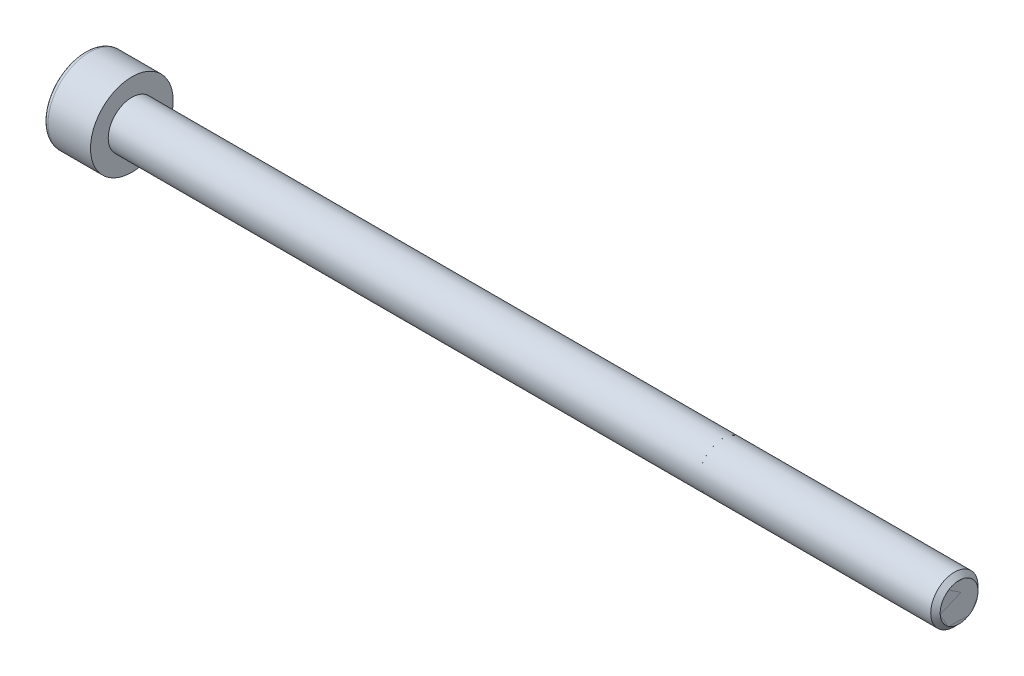
ISO-10303-21;
HEADER;
FILE_DESCRIPTION(('STEP AP214'),'2;1');
FILE_NAME('part.step','',(''),(''),'','','');
FILE_SCHEMA(('AUTOMOTIVE_DESIGN { 1 0 10303 214 1 1 1 1 }'));
ENDSEC;
DATA;
#1=APPLICATION_CONTEXT('core data for automotive mechanical design processes');
#2=APPLICATION_PROTOCOL_DEFINITION('international standard','automotive_design',2000,#1);
#3=PRODUCT_CONTEXT('',#1,'mechanical');
#4=PRODUCT('Part','Part','',(#3));
#5=PRODUCT_RELATED_PRODUCT_CATEGORY('part','',(#4));
#6=PRODUCT_DEFINITION_FORMATION('','',#4);
#7=PRODUCT_DEFINITION_CONTEXT('part definition',#1,'design');
#8=PRODUCT_DEFINITION('design','',#6,#7);
#9=PRODUCT_DEFINITION_SHAPE('','',#8);
#10=(LENGTH_UNIT() NAMED_UNIT(*) SI_UNIT(.MILLI.,.METRE.));
#11=(NAMED_UNIT(*) PLANE_ANGLE_UNIT() SI_UNIT($,.RADIAN.));
#12=(NAMED_UNIT(*) SI_UNIT($,.STERADIAN.) SOLID_ANGLE_UNIT());
#13=UNCERTAINTY_MEASURE_WITH_UNIT(LENGTH_MEASURE(1.E-05),#10,'distance_accuracy_value','');
#14=(GEOMETRIC_REPRESENTATION_CONTEXT(3) GLOBAL_UNCERTAINTY_ASSIGNED_CONTEXT((#13)) GLOBAL_UNIT_ASSIGNED_CONTEXT((#10,
#11,#12)) REPRESENTATION_CONTEXT('',''));
#15=CARTESIAN_POINT('',(0.,0.,0.));
#16=DIRECTION('',(0.,0.,1.));
#17=DIRECTION('',(1.,0.,0.));
#18=AXIS2_PLACEMENT_3D('',#15,#16,#17);
#19=CARTESIAN_POINT('',(2.,1.5,-0.8660254037844));
#20=DIRECTION('',(0.,0.500000000000017,-0.866025403784429));
#21=DIRECTION('',(0.,0.866025403784429,0.500000000000017));
#22=AXIS2_PLACEMENT_3D('',#19,#20,#21);
#23=PLANE('',#22);
#24=DIRECTION('',(0.,0.866025403784429,0.500000000000017));
#25=VECTOR('',#24,1.);
#26=CARTESIAN_POINT('',(2.,1.5,-0.8660254037844));
#27=LINE('',#26,#25);
#28=CARTESIAN_POINT('',(2.,1.5,-0.8660254037844));
#29=VERTEX_POINT('',#28);
#30=CARTESIAN_POINT('',(2.,0.,-1.73205080756895));
#31=VERTEX_POINT('',#30);
#32=EDGE_CURVE('P0_E71',#29,#31,#27,.F.);
#33=ORIENTED_EDGE('',*,*,#32,.F.);
#34=DIRECTION('',(1.,0.,0.));
#35=VECTOR('',#34,1.);
#36=CARTESIAN_POINT('',(2.,1.5,-0.8660254037844));
#37=LINE('',#36,#35);
#38=CARTESIAN_POINT('',(0.,1.5,-0.8660254037844));
#39=VERTEX_POINT('',#38);
#40=EDGE_CURVE('P0_E95',#29,#39,#37,.F.);
#41=ORIENTED_EDGE('',*,*,#40,.T.);
#42=DIRECTION('',(0.,0.866025403784429,0.500000000000017));
#43=VECTOR('',#42,1.);
#44=CARTESIAN_POINT('',(0.,1.5,-0.8660254037844));
#45=LINE('',#44,#43);
#46=CARTESIAN_POINT('',(0.,0.,-1.73205080756898));
#47=VERTEX_POINT('',#46);
#48=EDGE_CURVE('P0_E81',#47,#39,#45,.T.);
#49=ORIENTED_EDGE('',*,*,#48,.F.);
#50=DIRECTION('',(1.,0.,0.));
#51=VECTOR('',#50,1.);
#52=CARTESIAN_POINT('',(2.,0.,-1.732050807569));
#53=LINE('',#52,#51);
#54=EDGE_CURVE('P0_E90',#47,#31,#53,.T.);
#55=ORIENTED_EDGE('',*,*,#54,.T.);
#56=EDGE_LOOP('',(#33,#41,#49,#55));
#57=FACE_BOUND('',#56,.T.);
#58=ADVANCED_FACE('P0_F17',(#57),#23,.F.);
#59=CARTESIAN_POINT('',(2.,0.,-1.732050807569));
#60=DIRECTION('',(0.,-0.500000000000017,-0.866025403784429));
#61=DIRECTION('',(0.,0.866025403784429,-0.500000000000017));
#62=AXIS2_PLACEMENT_3D('',#59,#60,#61);
#63=PLANE('',#62);
#64=DIRECTION('',(0.,0.866025403784429,-0.500000000000017));
#65=VECTOR('',#64,1.);
#66=CARTESIAN_POINT('',(2.,0.,-1.732050807569));
#67=LINE('',#66,#65);
#68=CARTESIAN_POINT('',(2.,-1.50000000000003,-0.866025403784446));
#69=VERTEX_POINT('',#68);
#70=EDGE_CURVE('P0_E99',#31,#69,#67,.F.);
#71=ORIENTED_EDGE('',*,*,#70,.F.);
#72=ORIENTED_EDGE('',*,*,#54,.F.);
#73=DIRECTION('',(0.,0.866025403784429,-0.500000000000017));
#74=VECTOR('',#73,1.);
#75=CARTESIAN_POINT('',(0.,0.,-1.732050807569));
#76=LINE('',#75,#74);
#77=CARTESIAN_POINT('',(0.,-1.50000000000001,-0.866025403784423));
#78=VERTEX_POINT('',#77);
#79=EDGE_CURVE('P0_E76',#78,#47,#76,.T.);
#80=ORIENTED_EDGE('',*,*,#79,.F.);
#81=DIRECTION('',(1.,0.,0.));
#82=VECTOR('',#81,1.);
#83=CARTESIAN_POINT('',(2.,-1.5,-0.8660254037844));
#84=LINE('',#83,#82);
#85=EDGE_CURVE('P0_E168',#78,#69,#84,.T.);
#86=ORIENTED_EDGE('',*,*,#85,.T.);
#87=EDGE_LOOP('',(#71,#72,#80,#86));
#88=FACE_BOUND('',#87,.T.);
#89=ADVANCED_FACE('P0_F98',(#88),#63,.F.);
#90=CARTESIAN_POINT('',(2.,1.5,0.8660254037844));
#91=DIRECTION('',(0.,1.,0.));
#92=DIRECTION('',(0.,0.,1.));
#93=AXIS2_PLACEMENT_3D('',#90,#91,#92);
#94=PLANE('',#93);
#95=DIRECTION('',(0.,0.,1.));
#96=VECTOR('',#95,1.);
#97=CARTESIAN_POINT('',(2.,1.5,0.));
#98=LINE('',#97,#96);
#99=CARTESIAN_POINT('',(2.,1.50000000000001,0.866025403784423));
#100=VERTEX_POINT('',#99);
#101=EDGE_CURVE('P0_E166',#100,#29,#98,.F.);
#102=ORIENTED_EDGE('',*,*,#101,.F.);
#103=DIRECTION('',(1.,0.,0.));
#104=VECTOR('',#103,1.);
#105=CARTESIAN_POINT('',(2.,1.50000000000005,0.866025403784492));
#106=LINE('',#105,#104);
#107=CARTESIAN_POINT('',(0.,1.50000000000001,0.866025403784423));
#108=VERTEX_POINT('',#107);
#109=EDGE_CURVE('P0_E155',#100,#108,#106,.F.);
#110=ORIENTED_EDGE('',*,*,#109,.T.);
#111=DIRECTION('',(0.,0.,1.));
#112=VECTOR('',#111,1.);
#113=CARTESIAN_POINT('',(0.,1.5,0.8660254037844));
#114=LINE('',#113,#112);
#115=EDGE_CURVE('P0_E101',#39,#108,#114,.T.);
#116=ORIENTED_EDGE('',*,*,#115,.F.);
#117=ORIENTED_EDGE('',*,*,#40,.F.);
#118=EDGE_LOOP('',(#102,#110,#116,#117));
#119=FACE_BOUND('',#118,.T.);
#120=ADVANCED_FACE('P0_F174',(#119),#94,.F.);
#121=CARTESIAN_POINT('',(2.,-1.5,-0.8660254037844));
#122=DIRECTION('',(0.,-1.,0.));
#123=DIRECTION('',(0.,0.,-1.));
#124=AXIS2_PLACEMENT_3D('',#121,#122,#123);
#125=PLANE('',#124);
#126=DIRECTION('',(0.,0.,1.));
#127=VECTOR('',#126,1.);
#128=CARTESIAN_POINT('',(2.,-1.5,0.));
#129=LINE('',#128,#127);
#130=CARTESIAN_POINT('',(2.,-1.5,0.8660254037844));
#131=VERTEX_POINT('',#130);
#132=EDGE_CURVE('P0_E163',#69,#131,#129,.T.);
#133=ORIENTED_EDGE('',*,*,#132,.F.);
#134=ORIENTED_EDGE('',*,*,#85,.F.);
#135=DIRECTION('',(0.,0.,-1.));
#136=VECTOR('',#135,1.);
#137=CARTESIAN_POINT('',(0.,-1.5,-0.8660254037844));
#138=LINE('',#137,#136);
#139=CARTESIAN_POINT('',(0.,-1.5,0.8660254037844));
#140=VERTEX_POINT('',#139);
#141=EDGE_CURVE('P0_E85',#140,#78,#138,.T.);
#142=ORIENTED_EDGE('',*,*,#141,.F.);
#143=DIRECTION('',(1.,0.,0.));
#144=VECTOR('',#143,1.);
#145=CARTESIAN_POINT('',(2.,-1.5,0.8660254037844));
#146=LINE('',#145,#144);
#147=EDGE_CURVE('P0_E153',#140,#131,#146,.T.);
#148=ORIENTED_EDGE('',*,*,#147,.T.);
#149=EDGE_LOOP('',(#133,#134,#142,#148));
#150=FACE_BOUND('',#149,.T.);
#151=ADVANCED_FACE('P0_F268',(#150),#125,.F.);
#152=CARTESIAN_POINT('',(2.,0.,0.));
#153=DIRECTION('',(-1.,0.,0.));
#154=DIRECTION('',(0.,0.,1.));
#155=AXIS2_PLACEMENT_3D('',#152,#153,#154);
#156=PLANE('',#155);
#157=ORIENTED_EDGE('',*,*,#132,.T.);
#158=DIRECTION('',(0.,-0.866025403784429,-0.500000000000017));
#159=VECTOR('',#158,1.);
#160=CARTESIAN_POINT('',(2.,-1.5,0.8660254037844));
#161=LINE('',#160,#159);
#162=CARTESIAN_POINT('',(2.,0.,1.73205080756898));
#163=VERTEX_POINT('',#162);
#164=EDGE_CURVE('P0_E151',#131,#163,#161,.F.);
#165=ORIENTED_EDGE('',*,*,#164,.T.);
#166=DIRECTION('',(0.,-0.866025403784429,0.500000000000017));
#167=VECTOR('',#166,1.);
#168=CARTESIAN_POINT('',(2.,0.,1.732050807569));
#169=LINE('',#168,#167);
#170=EDGE_CURVE('P0_E158',#163,#100,#169,.F.);
#171=ORIENTED_EDGE('',*,*,#170,.T.);
#172=ORIENTED_EDGE('',*,*,#101,.T.);
#173=ORIENTED_EDGE('',*,*,#32,.T.);
#174=ORIENTED_EDGE('',*,*,#70,.T.);
#175=EDGE_LOOP('',(#157,#165,#171,#172,#173,#174));
#176=FACE_BOUND('',#175,.T.);
#177=ADVANCED_FACE('P0_F259',(#176),#156,.T.);
#178=CARTESIAN_POINT('',(2.,0.,1.732050807569));
#179=DIRECTION('',(0.,0.500000000000017,0.866025403784429));
#180=DIRECTION('',(0.,-0.866025403784429,0.500000000000017));
#181=AXIS2_PLACEMENT_3D('',#178,#179,#180);
#182=PLANE('',#181);
#183=ORIENTED_EDGE('',*,*,#170,.F.);
#184=DIRECTION('',(1.,0.,0.));
#185=VECTOR('',#184,1.);
#186=CARTESIAN_POINT('',(2.,0.,1.73205080756891));
#187=LINE('',#186,#185);
#188=CARTESIAN_POINT('',(0.,0.,1.73205080756898));
#189=VERTEX_POINT('',#188);
#190=EDGE_CURVE('P0_E142',#163,#189,#187,.F.);
#191=ORIENTED_EDGE('',*,*,#190,.T.);
#192=DIRECTION('',(0.,-0.866025403784429,0.500000000000017));
#193=VECTOR('',#192,1.);
#194=CARTESIAN_POINT('',(0.,0.,1.732050807569));
#195=LINE('',#194,#193);
#196=EDGE_CURVE('P0_E161',#108,#189,#195,.T.);
#197=ORIENTED_EDGE('',*,*,#196,.F.);
#198=ORIENTED_EDGE('',*,*,#109,.F.);
#199=EDGE_LOOP('',(#183,#191,#197,#198));
#200=FACE_BOUND('',#199,.T.);
#201=ADVANCED_FACE('P0_F177',(#200),#182,.F.);
#202=CARTESIAN_POINT('',(2.,-1.5,0.8660254037844));
#203=DIRECTION('',(0.,-0.500000000000017,0.866025403784429));
#204=DIRECTION('',(0.,-0.866025403784429,-0.500000000000017));
#205=AXIS2_PLACEMENT_3D('',#202,#203,#204);
#206=PLANE('',#205);
#207=ORIENTED_EDGE('',*,*,#164,.F.);
#208=ORIENTED_EDGE('',*,*,#147,.F.);
#209=DIRECTION('',(0.,-0.866025403784398,-0.50000000000007));
#210=VECTOR('',#209,1.);
#211=CARTESIAN_POINT('',(0.,0.,1.732050807569));
#212=LINE('',#211,#210);
#213=EDGE_CURVE('P0_E150',#189,#140,#212,.T.);
#214=ORIENTED_EDGE('',*,*,#213,.F.);
#215=ORIENTED_EDGE('',*,*,#190,.F.);
#216=EDGE_LOOP('',(#207,#208,#214,#215));
#217=FACE_BOUND('',#216,.T.);
#218=ADVANCED_FACE('P0_F183',(#217),#206,.F.);
#219=CARTESIAN_POINT('',(0.,0.,0.));
#220=DIRECTION('',(-1.,0.,0.));
#221=DIRECTION('',(0.,0.,1.));
#222=AXIS2_PLACEMENT_3D('',#219,#220,#221);
#223=PLANE('',#222);
#224=ORIENTED_EDGE('',*,*,#196,.T.);
#225=ORIENTED_EDGE('',*,*,#213,.T.);
#226=ORIENTED_EDGE('',*,*,#141,.T.);
#227=ORIENTED_EDGE('',*,*,#79,.T.);
#228=ORIENTED_EDGE('',*,*,#48,.T.);
#229=ORIENTED_EDGE('',*,*,#115,.T.);
#230=EDGE_LOOP('',(#224,#225,#226,#227,#228,#229));
#231=FACE_BOUND('',#230,.T.);
#232=CARTESIAN_POINT('',(0.,0.,0.));
#233=DIRECTION('',(1.,0.,0.));
#234=DIRECTION('',(0.,-1.,0.));
#235=AXIS2_PLACEMENT_3D('',#232,#233,#234);
#236=CIRCLE('',#235,3.1);
#237=CARTESIAN_POINT('',(0.,-3.1,0.));
#238=VERTEX_POINT('',#237);
#239=CARTESIAN_POINT('',(0.,3.1,0.));
#240=VERTEX_POINT('',#239);
#241=EDGE_CURVE('P0_E36',#238,#240,#236,.T.);
#242=ORIENTED_EDGE('',*,*,#241,.F.);
#243=CARTESIAN_POINT('',(0.,0.,0.));
#244=DIRECTION('',(1.,0.,0.));
#245=DIRECTION('',(0.,1.,0.));
#246=AXIS2_PLACEMENT_3D('',#243,#244,#245);
#247=CIRCLE('',#246,3.1);
#248=EDGE_CURVE('P0_E117',#240,#238,#247,.T.);
#249=ORIENTED_EDGE('',*,*,#248,.F.);
#250=EDGE_LOOP('',(#242,#249));
#251=FACE_BOUND('',#250,.T.);
#252=ADVANCED_FACE('P0_F79',(#231,#251),#223,.T.);
#253=CARTESIAN_POINT('',(0.4,0.,0.));
#254=DIRECTION('',(-1.,0.,0.));
#255=DIRECTION('',(0.,1.,0.));
#256=AXIS2_PLACEMENT_3D('',#253,#254,#255);
#257=TOROIDAL_SURFACE('',#256,3.1,0.4);
#258=CARTESIAN_POINT('',(0.399999999999998,0.,0.));
#259=DIRECTION('',(-1.,0.,0.));
#260=DIRECTION('',(0.,0.,1.));
#261=AXIS2_PLACEMENT_3D('',#258,#259,#260);
#262=CIRCLE('',#261,3.5);
#263=CARTESIAN_POINT('',(0.399999999999998,0.,3.5));
#264=VERTEX_POINT('',#263);
#265=EDGE_CURVE('P0_E113',#264,#264,#262,.F.);
#266=ORIENTED_EDGE('',*,*,#265,.F.);
#267=EDGE_LOOP('',(#266));
#268=FACE_BOUND('',#267,.T.);
#269=ORIENTED_EDGE('',*,*,#248,.T.);
#270=ORIENTED_EDGE('',*,*,#241,.T.);
#271=EDGE_LOOP('',(#269,#270));
#272=FACE_BOUND('',#271,.T.);
#273=ADVANCED_FACE('P0_F125',(#268,#272),#257,.T.);
#274=CARTESIAN_POINT('',(77.7,0.,0.));
#275=DIRECTION('',(-1.,0.,0.));
#276=DIRECTION('',(0.,0.,1.));
#277=AXIS2_PLACEMENT_3D('',#274,#275,#276);
#278=CYLINDRICAL_SURFACE('',#277,3.5);
#279=CARTESIAN_POINT('',(4.,0.,0.));
#280=DIRECTION('',(-1.,0.,0.));
#281=DIRECTION('',(0.,0.,1.));
#282=AXIS2_PLACEMENT_3D('',#279,#280,#281);
#283=CIRCLE('',#282,3.5);
#284=CARTESIAN_POINT('',(4.,0.,3.5));
#285=VERTEX_POINT('',#284);
#286=EDGE_CURVE('P0_E111',#285,#285,#283,.T.);
#287=ORIENTED_EDGE('',*,*,#286,.T.);
#288=EDGE_LOOP('',(#287));
#289=FACE_BOUND('',#288,.T.);
#290=ORIENTED_EDGE('',*,*,#265,.T.);
#291=EDGE_LOOP('',(#290));
#292=FACE_BOUND('',#291,.T.);
#293=ADVANCED_FACE('P0_F130',(#289,#292),#278,.T.);
#294=CARTESIAN_POINT('',(74.,0.,0.));
#295=DIRECTION('',(-1.,0.,0.));
#296=DIRECTION('',(0.,0.,1.));
#297=AXIS2_PLACEMENT_3D('',#294,#295,#296);
#298=PLANE('',#297);
#299=CARTESIAN_POINT('',(74.0000000000123,0.,0.));
#300=DIRECTION('',(-1.,0.,0.));
#301=DIRECTION('',(0.,0.,1.));
#302=AXIS2_PLACEMENT_3D('',#299,#300,#301);
#303=CIRCLE('',#302,1.59999999999627);
#304=CARTESIAN_POINT('',(74.0000000000123,0.,1.59999999999627));
#305=VERTEX_POINT('',#304);
#306=EDGE_CURVE('P0_E108',#305,#305,#303,.T.);
#307=ORIENTED_EDGE('',*,*,#306,.F.);
#308=EDGE_LOOP('',(#307));
#309=FACE_BOUND('',#308,.T.);
#310=ADVANCED_FACE('P0_F219',(#309),#298,.F.);
#311=CARTESIAN_POINT('',(4.,0.,0.));
#312=DIRECTION('',(-1.,0.,0.));
#313=DIRECTION('',(0.,0.,1.));
#314=AXIS2_PLACEMENT_3D('',#311,#312,#313);
#315=PLANE('',#314);
#316=CARTESIAN_POINT('',(4.,0.,0.));
#317=DIRECTION('',(-1.,0.,0.));
#318=DIRECTION('',(0.,0.,1.));
#319=AXIS2_PLACEMENT_3D('',#316,#317,#318);
#320=CIRCLE('',#319,2.);
#321=CARTESIAN_POINT('',(4.,0.,2.));
#322=VERTEX_POINT('',#321);
#323=EDGE_CURVE('P0_E28',#322,#322,#320,.F.);
#324=ORIENTED_EDGE('',*,*,#323,.F.);
#325=EDGE_LOOP('',(#324));
#326=FACE_BOUND('',#325,.T.);
#327=ORIENTED_EDGE('',*,*,#286,.F.);
#328=EDGE_LOOP('',(#327));
#329=FACE_BOUND('',#328,.T.);
#330=ADVANCED_FACE('P0_F213',(#326,#329),#315,.F.);
#331=CARTESIAN_POINT('',(73.6000000001127,0.,0.));
#332=DIRECTION('',(-1.,0.,0.));
#333=DIRECTION('',(0.,0.,1.));
#334=AXIS2_PLACEMENT_3D('',#331,#332,#333);
#335=CONICAL_SURFACE('',#334,1.99999999989586,0.785398163397448);
#336=ORIENTED_EDGE('',*,*,#306,.T.);
#337=EDGE_LOOP('',(#336));
#338=FACE_BOUND('',#337,.T.);
#339=CARTESIAN_POINT('',(73.6,0.,0.));
#340=DIRECTION('',(-1.,0.,0.));
#341=DIRECTION('',(0.,0.,1.));
#342=AXIS2_PLACEMENT_3D('',#339,#340,#341);
#343=CIRCLE('',#342,2.);
#344=CARTESIAN_POINT('',(73.6,0.,2.));
#345=VERTEX_POINT('',#344);
#346=EDGE_CURVE('P0_E11',#345,#345,#343,.T.);
#347=ORIENTED_EDGE('',*,*,#346,.F.);
#348=EDGE_LOOP('',(#347));
#349=FACE_BOUND('',#348,.T.);
#350=ADVANCED_FACE('P0_F207',(#338,#349),#335,.T.);
#351=CARTESIAN_POINT('',(77.7,0.,0.));
#352=DIRECTION('',(-1.,0.,0.));
#353=DIRECTION('',(0.,0.,1.));
#354=AXIS2_PLACEMENT_3D('',#351,#352,#353);
#355=CYLINDRICAL_SURFACE('',#354,2.);
#356=ORIENTED_EDGE('',*,*,#346,.T.);
#357=EDGE_LOOP('',(#356));
#358=FACE_BOUND('',#357,.T.);
#359=ORIENTED_EDGE('',*,*,#323,.T.);
#360=EDGE_LOOP('',(#359));
#361=FACE_BOUND('',#360,.T.);
#362=ADVANCED_FACE('P0_F205',(#358,#361),#355,.T.);
#363=CLOSED_SHELL('',(#58,#89,#120,#151,#177,#201,#218,#252,#273,#293,#310,#330,#350,#362));
#364=MANIFOLD_SOLID_BREP('P0_B1',#363);
#365=CARTESIAN_POINT('',(54.,0.,0.));
#366=DIRECTION('',(1.,0.,0.));
#367=DIRECTION('',(0.,0.,-1.));
#368=AXIS2_PLACEMENT_3D('',#365,#366,#367);
#369=PLANE('',#368);
#370=CARTESIAN_POINT('',(54.,-2.,0.));
#371=CARTESIAN_POINT('',(54.,-1.99774586766325,-0.402717718090076));
#372=CARTESIAN_POINT('',(54.,-1.84788068745405,-0.764664479633677));
#373=CARTESIAN_POINT('',(54.,-1.69532712507373,-1.13310408507384));
#374=CARTESIAN_POINT('',(54.,-1.41417740186145,-1.41429353376039));
#375=CARTESIAN_POINT('',(54.,-1.13318421417824,-1.69532642479994));
#376=CARTESIAN_POINT('',(54.,-0.765364797462188,-1.8477599065349));
#377=CARTESIAN_POINT('',(54.,-0.398369886191421,-1.99985169278011));
#378=CARTESIAN_POINT('',(54.,0.,-1.99995802016326));
#379=CARTESIAN_POINT('',(54.,0.397297997638056,-2.00006406145273));
#380=CARTESIAN_POINT('',(54.,0.765364797462188,-1.8477599065349));
#381=CARTESIAN_POINT('',(54.,1.13227384248478,-1.69593482461887));
#382=CARTESIAN_POINT('',(54.,1.41417740186145,-1.41429353376039));
#383=CARTESIAN_POINT('',(54.,1.69472319973728,-1.13400874121154));
#384=CARTESIAN_POINT('',(54.,1.84788068745406,-0.764664479633658));
#385=CARTESIAN_POINT('',(54.,1.99774279237885,-0.403267140808738));
#386=CARTESIAN_POINT('',(54.,2.,0.));
#387=B_SPLINE_CURVE_WITH_KNOTS('',2,(#370,#371,#372,#373,#374,#375,#376,#377,#378,#379,#380,
#381,#382,#383,#384,#385,#386),.UNSPECIFIED.,.F.,.F.,(3,2,2,2,2,2,2,2,3),(0.,0.125,0.25,0.375,
0.5,0.625,0.75,0.875,1.),.UNSPECIFIED.);
#388=CARTESIAN_POINT('',(54.,-2.,0.));
#389=VERTEX_POINT('',#388);
#390=CARTESIAN_POINT('',(54.,2.,0.));
#391=VERTEX_POINT('',#390);
#392=EDGE_CURVE('P1_E32',#389,#391,#387,.T.);
#393=ORIENTED_EDGE('',*,*,#392,.F.);
#394=CARTESIAN_POINT('',(54.,2.,0.));
#395=CARTESIAN_POINT('',(54.,1.99774586766324,0.402717718090762));
#396=CARTESIAN_POINT('',(54.,1.84788068745406,0.764664479633658));
#397=CARTESIAN_POINT('',(54.,1.69532712507302,1.13310408507488));
#398=CARTESIAN_POINT('',(54.,1.41417740186145,1.41429353376039));
#399=CARTESIAN_POINT('',(54.,1.13318421417782,1.69532642480003));
#400=CARTESIAN_POINT('',(54.,0.765364797462188,1.8477599065349));
#401=CARTESIAN_POINT('',(54.,0.398369886191615,1.99985169278011));
#402=CARTESIAN_POINT('',(54.,0.,1.99995802016326));
#403=CARTESIAN_POINT('',(54.,-0.39729799763825,2.00006406145273));
#404=CARTESIAN_POINT('',(54.,-0.765364797462188,1.8477599065349));
#405=CARTESIAN_POINT('',(54.,-1.13227384248465,1.69593482461884));
#406=CARTESIAN_POINT('',(54.,-1.41417740186145,1.41429353376039));
#407=CARTESIAN_POINT('',(54.,-1.69472319973738,1.13400874121161));
#408=CARTESIAN_POINT('',(54.,-1.84788068745405,0.764664479633677));
#409=CARTESIAN_POINT('',(54.,-1.99774279237885,0.403267140808441));
#410=CARTESIAN_POINT('',(54.,-2.,0.));
#411=B_SPLINE_CURVE_WITH_KNOTS('',2,(#394,#395,#396,#397,#398,#399,#400,#401,#402,#403,#404,
#405,#406,#407,#408,#409,#410),.UNSPECIFIED.,.F.,.F.,(3,2,2,2,2,2,2,2,3),(0.,0.125,0.25,0.375,
0.5,0.625,0.75,0.875,1.),.UNSPECIFIED.);
#412=EDGE_CURVE('P1_E30',#391,#389,#411,.T.);
#413=ORIENTED_EDGE('',*,*,#412,.F.);
#414=EDGE_LOOP('',(#393,#413));
#415=FACE_BOUND('',#414,.T.);
#416=ADVANCED_FACE('P1_F17',(#415),#369,.F.);
#417=CARTESIAN_POINT('',(74.,0.,0.));
#418=DIRECTION('',(1.,0.,0.));
#419=DIRECTION('',(0.,0.,-1.));
#420=AXIS2_PLACEMENT_3D('',#417,#418,#419);
#421=PLANE('',#420);
#422=CARTESIAN_POINT('',(74.,0.,0.));
#423=DIRECTION('',(1.,0.,0.));
#424=DIRECTION('',(0.,0.,-1.));
#425=AXIS2_PLACEMENT_3D('',#422,#423,#424);
#426=CIRCLE('',#425,1.6);
#427=CARTESIAN_POINT('',(74.,0.,-1.6));
#428=VERTEX_POINT('',#427);
#429=EDGE_CURVE('P1_E20',#428,#428,#426,.F.);
#430=ORIENTED_EDGE('',*,*,#429,.F.);
#431=EDGE_LOOP('',(#430));
#432=FACE_BOUND('',#431,.T.);
#433=ADVANCED_FACE('P1_F50',(#432),#421,.T.);
#434=CARTESIAN_POINT('',(54.,0.,0.));
#435=DIRECTION('',(1.,0.,0.));
#436=DIRECTION('',(0.,0.,-1.));
#437=AXIS2_PLACEMENT_3D('',#434,#435,#436);
#438=PLANE('',#437);
#439=CARTESIAN_POINT('',(54.,0.,0.));
#440=DIRECTION('',(1.,0.,0.));
#441=DIRECTION('',(0.,0.,-1.));
#442=AXIS2_PLACEMENT_3D('',#439,#440,#441);
#443=CIRCLE('',#442,1.6);
#444=CARTESIAN_POINT('',(54.,0.,-1.6));
#445=VERTEX_POINT('',#444);
#446=EDGE_CURVE('P1_E11',#445,#445,#443,.T.);
#447=ORIENTED_EDGE('',*,*,#446,.F.);
#448=EDGE_LOOP('',(#447));
#449=FACE_BOUND('',#448,.T.);
#450=ORIENTED_EDGE('',*,*,#392,.T.);
#451=ORIENTED_EDGE('',*,*,#412,.T.);
#452=EDGE_LOOP('',(#450,#451));
#453=FACE_BOUND('',#452,.T.);
#454=ADVANCED_FACE('P1_F35',(#449,#453),#438,.T.);
#455=CARTESIAN_POINT('',(53.,0.,0.));
#456=DIRECTION('',(1.,0.,0.));
#457=DIRECTION('',(0.,0.,-1.));
#458=AXIS2_PLACEMENT_3D('',#455,#456,#457);
#459=CYLINDRICAL_SURFACE('',#458,1.6);
#460=ORIENTED_EDGE('',*,*,#429,.T.);
#461=EDGE_LOOP('',(#460));
#462=FACE_BOUND('',#461,.T.);
#463=ORIENTED_EDGE('',*,*,#446,.T.);
#464=EDGE_LOOP('',(#463));
#465=FACE_BOUND('',#464,.T.);
#466=ADVANCED_FACE('P1_F49',(#462,#465),#459,.T.);
#467=CLOSED_SHELL('',(#416,#433,#454,#466));
#468=MANIFOLD_SOLID_BREP('P1_B1',#467);
#469=ADVANCED_BREP_SHAPE_REPRESENTATION('',(#18,#364,#468),#14);
#470=SHAPE_DEFINITION_REPRESENTATION(#9,#469);
ENDSEC;
END-ISO-10303-21;
